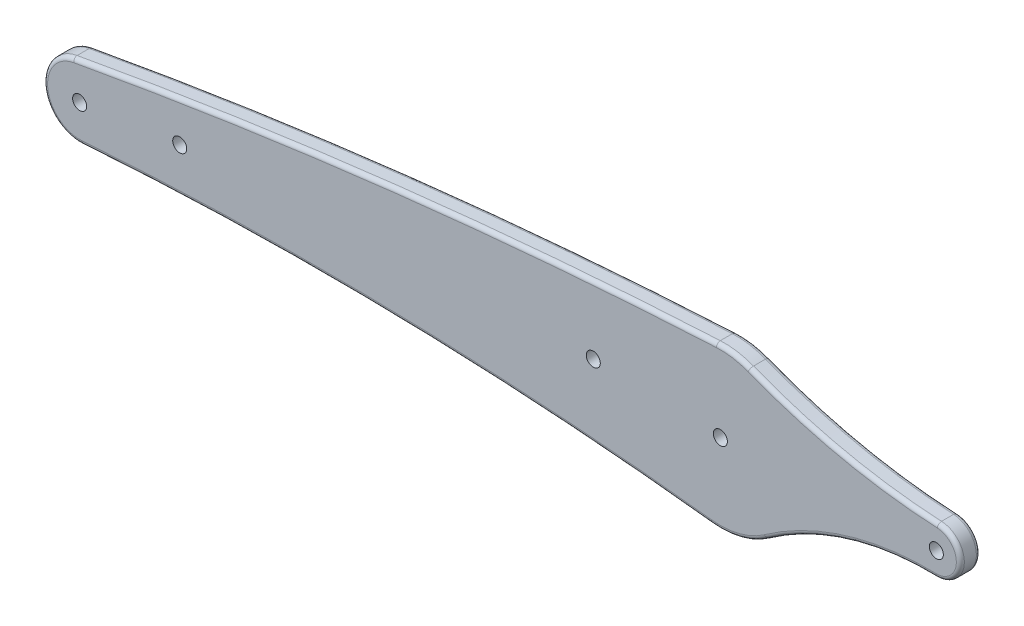
ISO-10303-21;
HEADER;
FILE_DESCRIPTION(('STEP AP214'),'2;1');
FILE_NAME('part.step','',(''),(''),'','','');
FILE_SCHEMA(('AUTOMOTIVE_DESIGN { 1 0 10303 214 1 1 1 1 }'));
ENDSEC;
DATA;
#1=APPLICATION_CONTEXT('core data for automotive mechanical design processes');
#2=APPLICATION_PROTOCOL_DEFINITION('international standard','automotive_design',2000,#1);
#3=PRODUCT_CONTEXT('',#1,'mechanical');
#4=PRODUCT('Part','Part','',(#3));
#5=PRODUCT_RELATED_PRODUCT_CATEGORY('part','',(#4));
#6=PRODUCT_DEFINITION_FORMATION('','',#4);
#7=PRODUCT_DEFINITION_CONTEXT('part definition',#1,'design');
#8=PRODUCT_DEFINITION('design','',#6,#7);
#9=PRODUCT_DEFINITION_SHAPE('','',#8);
#10=(LENGTH_UNIT() NAMED_UNIT(*) SI_UNIT(.MILLI.,.METRE.));
#11=(NAMED_UNIT(*) PLANE_ANGLE_UNIT() SI_UNIT($,.RADIAN.));
#12=(NAMED_UNIT(*) SI_UNIT($,.STERADIAN.) SOLID_ANGLE_UNIT());
#13=UNCERTAINTY_MEASURE_WITH_UNIT(LENGTH_MEASURE(1.E-05),#10,'distance_accuracy_value','');
#14=(GEOMETRIC_REPRESENTATION_CONTEXT(3) GLOBAL_UNCERTAINTY_ASSIGNED_CONTEXT((#13)) GLOBAL_UNIT_ASSIGNED_CONTEXT((#10,
#11,#12)) REPRESENTATION_CONTEXT('',''));
#15=CARTESIAN_POINT('',(0.,0.,0.));
#16=DIRECTION('',(0.,0.,1.));
#17=DIRECTION('',(1.,0.,0.));
#18=AXIS2_PLACEMENT_3D('',#15,#16,#17);
#19=CARTESIAN_POINT('',(69.6215603537575,-1025.09903526355,2.5));
#20=DIRECTION('',(0.,0.,-1.));
#21=DIRECTION('',(-1.,0.,0.));
#22=AXIS2_PLACEMENT_3D('',#19,#20,#21);
#23=CYLINDRICAL_SURFACE('',#22,1250.);
#24=DIRECTION('',(0.,0.,-1.));
#25=VECTOR('',#24,1.);
#26=CARTESIAN_POINT('',(6.19242396528043,223.290625322045,2.5));
#27=LINE('',#26,#25);
#28=CARTESIAN_POINT('',(6.19242396528043,223.290625322045,1.5));
#29=VERTEX_POINT('',#28);
#30=CARTESIAN_POINT('',(6.19242396528043,223.290625322045,-1.5));
#31=VERTEX_POINT('',#30);
#32=EDGE_CURVE('E262',#29,#31,#27,.T.);
#33=ORIENTED_EDGE('',*,*,#32,.T.);
#34=CARTESIAN_POINT('',(69.6215603537575,-1025.09903526355,-1.5));
#35=DIRECTION('',(0.,0.,1.));
#36=DIRECTION('',(1.,0.,0.));
#37=AXIS2_PLACEMENT_3D('',#34,#35,#36);
#38=CIRCLE('',#37,1250.);
#39=CARTESIAN_POINT('',(-154.465632763782,204.650910815208,-1.5));
#40=VERTEX_POINT('',#39);
#41=EDGE_CURVE('E11',#31,#40,#38,.T.);
#42=ORIENTED_EDGE('',*,*,#41,.T.);
#43=DIRECTION('',(0.,0.,-1.));
#44=VECTOR('',#43,1.);
#45=CARTESIAN_POINT('',(-154.465632763782,204.650910815208,2.5));
#46=LINE('',#45,#44);
#47=CARTESIAN_POINT('',(-154.465632763782,204.650910815208,1.5));
#48=VERTEX_POINT('',#47);
#49=EDGE_CURVE('E173',#48,#40,#46,.T.);
#50=ORIENTED_EDGE('',*,*,#49,.F.);
#51=CARTESIAN_POINT('',(69.6215603537575,-1025.09903526355,1.5));
#52=DIRECTION('',(0.,0.,1.));
#53=DIRECTION('',(1.,0.,0.));
#54=AXIS2_PLACEMENT_3D('',#51,#52,#53);
#55=CIRCLE('',#54,1250.);
#56=EDGE_CURVE('E44',#48,#29,#55,.F.);
#57=ORIENTED_EDGE('',*,*,#56,.T.);
#58=EDGE_LOOP('',(#33,#42,#50,#57));
#59=FACE_BOUND('',#58,.T.);
#60=ADVANCED_FACE('F35',(#59),#23,.T.);
#61=CARTESIAN_POINT('',(-152.852204973335,195.796711203441,2.5));
#62=DIRECTION('',(0.,0.,-1.));
#63=DIRECTION('',(-1.,0.,0.));
#64=AXIS2_PLACEMENT_3D('',#61,#62,#63);
#65=CYLINDRICAL_SURFACE('',#64,9.00000000000001);
#66=ORIENTED_EDGE('',*,*,#49,.T.);
#67=CARTESIAN_POINT('',(-152.852204973335,195.796711203441,-1.5));
#68=DIRECTION('',(0.,0.,1.));
#69=DIRECTION('',(1.,0.,0.));
#70=AXIS2_PLACEMENT_3D('',#67,#68,#69);
#71=CIRCLE('',#70,9.00000000000001);
#72=CARTESIAN_POINT('',(-152.212583331485,186.819468633739,-1.5));
#73=VERTEX_POINT('',#72);
#74=EDGE_CURVE('E172',#40,#73,#71,.T.);
#75=ORIENTED_EDGE('',*,*,#74,.T.);
#76=DIRECTION('',(0.,0.,-1.));
#77=VECTOR('',#76,1.);
#78=CARTESIAN_POINT('',(-152.212583331485,186.819468633739,2.5));
#79=LINE('',#78,#77);
#80=CARTESIAN_POINT('',(-152.212583331485,186.819468633739,1.5));
#81=VERTEX_POINT('',#80);
#82=EDGE_CURVE('E155',#81,#73,#79,.T.);
#83=ORIENTED_EDGE('',*,*,#82,.F.);
#84=CARTESIAN_POINT('',(-152.852204973335,195.796711203441,1.5));
#85=DIRECTION('',(0.,0.,1.));
#86=DIRECTION('',(1.,0.,0.));
#87=AXIS2_PLACEMENT_3D('',#84,#85,#86);
#88=CIRCLE('',#87,9.00000000000001);
#89=EDGE_CURVE('E169',#81,#48,#88,.F.);
#90=ORIENTED_EDGE('',*,*,#89,.T.);
#91=EDGE_LOOP('',(#66,#75,#83,#90));
#92=FACE_BOUND('',#91,.T.);
#93=ADVANCED_FACE('F168',(#92),#65,.T.);
#94=CARTESIAN_POINT('',(-91.8038727123033,-661.031218504821,2.5));
#95=DIRECTION('',(0.,0.,-1.));
#96=DIRECTION('',(-1.,0.,0.));
#97=AXIS2_PLACEMENT_3D('',#94,#95,#96);
#98=CYLINDRICAL_SURFACE('',#97,850.);
#99=ORIENTED_EDGE('',*,*,#82,.T.);
#100=CARTESIAN_POINT('',(-91.8038727123033,-661.031218504821,-1.5));
#101=DIRECTION('',(0.,0.,1.));
#102=DIRECTION('',(1.,0.,0.));
#103=AXIS2_PLACEMENT_3D('',#100,#101,#102);
#104=CIRCLE('',#103,850.);
#105=CARTESIAN_POINT('',(4.93117146106389,183.446330769745,-1.5));
#106=VERTEX_POINT('',#105);
#107=EDGE_CURVE('E161',#73,#106,#104,.F.);
#108=ORIENTED_EDGE('',*,*,#107,.T.);
#109=DIRECTION('',(0.,0.,-1.));
#110=VECTOR('',#109,1.);
#111=CARTESIAN_POINT('',(4.93117146106389,183.446330769745,2.5));
#112=LINE('',#111,#110);
#113=CARTESIAN_POINT('',(4.93117146106389,183.446330769745,1.5));
#114=VERTEX_POINT('',#113);
#115=EDGE_CURVE('E157',#114,#106,#112,.T.);
#116=ORIENTED_EDGE('',*,*,#115,.F.);
#117=CARTESIAN_POINT('',(-91.8038727123033,-661.031218504821,1.5));
#118=DIRECTION('',(0.,0.,1.));
#119=DIRECTION('',(1.,0.,0.));
#120=AXIS2_PLACEMENT_3D('',#117,#118,#119);
#121=CIRCLE('',#120,850.);
#122=EDGE_CURVE('E152',#114,#81,#121,.T.);
#123=ORIENTED_EDGE('',*,*,#122,.T.);
#124=EDGE_LOOP('',(#99,#108,#116,#123));
#125=FACE_BOUND('',#124,.T.);
#126=ADVANCED_FACE('F154',(#125),#98,.F.);
#127=CARTESIAN_POINT('',(7.20729014749606,203.316390752676,2.5));
#128=DIRECTION('',(0.,0.,-1.));
#129=DIRECTION('',(-1.,0.,0.));
#130=AXIS2_PLACEMENT_3D('',#127,#128,#129);
#131=CYLINDRICAL_SURFACE('',#130,20.);
#132=ORIENTED_EDGE('',*,*,#115,.T.);
#133=CARTESIAN_POINT('',(7.20729014749606,203.316390752676,-1.5));
#134=DIRECTION('',(0.,0.,1.));
#135=DIRECTION('',(1.,0.,0.));
#136=AXIS2_PLACEMENT_3D('',#133,#134,#135);
#137=CIRCLE('',#136,20.);
#138=CARTESIAN_POINT('',(18.7678146313222,186.996026980417,-1.5));
#139=VERTEX_POINT('',#138);
#140=EDGE_CURVE('E299',#106,#139,#137,.T.);
#141=ORIENTED_EDGE('',*,*,#140,.T.);
#142=DIRECTION('',(0.,0.,-1.));
#143=VECTOR('',#142,1.);
#144=CARTESIAN_POINT('',(18.7678146313222,186.996026980417,2.5));
#145=LINE('',#144,#143);
#146=CARTESIAN_POINT('',(18.7678146313222,186.996026980417,1.5));
#147=VERTEX_POINT('',#146);
#148=EDGE_CURVE('E274',#147,#139,#145,.T.);
#149=ORIENTED_EDGE('',*,*,#148,.F.);
#150=CARTESIAN_POINT('',(7.20729014749606,203.316390752676,1.5));
#151=DIRECTION('',(0.,0.,1.));
#152=DIRECTION('',(1.,0.,0.));
#153=AXIS2_PLACEMENT_3D('',#150,#151,#152);
#154=CIRCLE('',#153,20.);
#155=EDGE_CURVE('E297',#147,#114,#154,.F.);
#156=ORIENTED_EDGE('',*,*,#155,.T.);
#157=EDGE_LOOP('',(#132,#141,#149,#156));
#158=FACE_BOUND('',#157,.T.);
#159=ADVANCED_FACE('F367',(#158),#131,.T.);
#160=CARTESIAN_POINT('',(59.2296503247137,129.874753777512,2.5));
#161=DIRECTION('',(0.,0.,-1.));
#162=DIRECTION('',(-1.,0.,0.));
#163=AXIS2_PLACEMENT_3D('',#160,#161,#162);
#164=CYLINDRICAL_SURFACE('',#163,70.);
#165=ORIENTED_EDGE('',*,*,#148,.T.);
#166=CARTESIAN_POINT('',(59.2296503247137,129.874753777512,-1.5));
#167=DIRECTION('',(0.,0.,1.));
#168=DIRECTION('',(1.,0.,0.));
#169=AXIS2_PLACEMENT_3D('',#166,#167,#168);
#170=CIRCLE('',#169,70.);
#171=CARTESIAN_POINT('',(60.9963625501948,199.852455425339,-1.5));
#172=VERTEX_POINT('',#171);
#173=EDGE_CURVE('E303',#139,#172,#170,.F.);
#174=ORIENTED_EDGE('',*,*,#173,.T.);
#175=DIRECTION('',(0.,0.,-1.));
#176=VECTOR('',#175,1.);
#177=CARTESIAN_POINT('',(60.9963625501948,199.852455425339,2.5));
#178=LINE('',#177,#176);
#179=CARTESIAN_POINT('',(60.9963625501948,199.852455425339,1.5));
#180=VERTEX_POINT('',#179);
#181=EDGE_CURVE('E271',#180,#172,#178,.T.);
#182=ORIENTED_EDGE('',*,*,#181,.F.);
#183=CARTESIAN_POINT('',(59.2296503247137,129.874753777512,1.5));
#184=DIRECTION('',(0.,0.,1.));
#185=DIRECTION('',(1.,0.,0.));
#186=AXIS2_PLACEMENT_3D('',#183,#184,#185);
#187=CIRCLE('',#186,70.);
#188=EDGE_CURVE('E301',#180,#147,#187,.T.);
#189=ORIENTED_EDGE('',*,*,#188,.T.);
#190=EDGE_LOOP('',(#165,#174,#182,#189));
#191=FACE_BOUND('',#190,.T.);
#192=ADVANCED_FACE('F365',(#191),#164,.F.);
#193=CARTESIAN_POINT('',(61.1477950266646,205.85054413801,2.5));
#194=DIRECTION('',(0.,0.,-1.));
#195=DIRECTION('',(-1.,0.,0.));
#196=AXIS2_PLACEMENT_3D('',#193,#194,#195);
#197=CYLINDRICAL_SURFACE('',#196,6.);
#198=ORIENTED_EDGE('',*,*,#181,.T.);
#199=CARTESIAN_POINT('',(61.1477950266646,205.85054413801,-1.5));
#200=DIRECTION('',(0.,0.,1.));
#201=DIRECTION('',(1.,0.,0.));
#202=AXIS2_PLACEMENT_3D('',#199,#200,#201);
#203=CIRCLE('',#202,6.);
#204=CARTESIAN_POINT('',(61.4538206674936,211.842734748058,-1.5));
#205=VERTEX_POINT('',#204);
#206=EDGE_CURVE('E307',#172,#205,#203,.T.);
#207=ORIENTED_EDGE('',*,*,#206,.T.);
#208=DIRECTION('',(0.,0.,-1.));
#209=VECTOR('',#208,1.);
#210=CARTESIAN_POINT('',(61.4538206674936,211.842734748058,2.5));
#211=LINE('',#210,#209);
#212=CARTESIAN_POINT('',(61.4538206674936,211.842734748058,1.5));
#213=VERTEX_POINT('',#212);
#214=EDGE_CURVE('E268',#213,#205,#211,.T.);
#215=ORIENTED_EDGE('',*,*,#214,.F.);
#216=CARTESIAN_POINT('',(61.1477950266646,205.85054413801,1.5));
#217=DIRECTION('',(0.,0.,1.));
#218=DIRECTION('',(1.,0.,0.));
#219=AXIS2_PLACEMENT_3D('',#216,#217,#218);
#220=CIRCLE('',#219,6.);
#221=EDGE_CURVE('E305',#213,#180,#220,.F.);
#222=ORIENTED_EDGE('',*,*,#221,.T.);
#223=EDGE_LOOP('',(#198,#207,#215,#222));
#224=FACE_BOUND('',#223,.T.);
#225=ADVANCED_FACE('F356',(#224),#197,.T.);
#226=CARTESIAN_POINT('',(69.1044616882186,361.647499999275,2.5));
#227=DIRECTION('',(0.,0.,-1.));
#228=DIRECTION('',(-1.,0.,0.));
#229=AXIS2_PLACEMENT_3D('',#226,#227,#228);
#230=CYLINDRICAL_SURFACE('',#229,150.);
#231=ORIENTED_EDGE('',*,*,#214,.T.);
#232=CARTESIAN_POINT('',(69.1044616882186,361.647499999275,-1.5));
#233=DIRECTION('',(0.,0.,1.));
#234=DIRECTION('',(1.,0.,0.));
#235=AXIS2_PLACEMENT_3D('',#232,#233,#234);
#236=CIRCLE('',#235,150.);
#237=CARTESIAN_POINT('',(14.4893103287575,221.943580075805,-1.5));
#238=VERTEX_POINT('',#237);
#239=EDGE_CURVE('E311',#205,#238,#236,.F.);
#240=ORIENTED_EDGE('',*,*,#239,.T.);
#241=DIRECTION('',(0.,0.,-1.));
#242=VECTOR('',#241,1.);
#243=CARTESIAN_POINT('',(14.4893103287575,221.943580075805,2.5));
#244=LINE('',#243,#242);
#245=CARTESIAN_POINT('',(14.4893103287575,221.943580075805,1.5));
#246=VERTEX_POINT('',#245);
#247=EDGE_CURVE('E265',#246,#238,#244,.T.);
#248=ORIENTED_EDGE('',*,*,#247,.F.);
#249=CARTESIAN_POINT('',(69.1044616882186,361.647499999275,1.5));
#250=DIRECTION('',(0.,0.,1.));
#251=DIRECTION('',(1.,0.,0.));
#252=AXIS2_PLACEMENT_3D('',#249,#250,#251);
#253=CIRCLE('',#252,150.);
#254=EDGE_CURVE('E309',#246,#213,#253,.T.);
#255=ORIENTED_EDGE('',*,*,#254,.T.);
#256=EDGE_LOOP('',(#231,#240,#248,#255));
#257=FACE_BOUND('',#256,.T.);
#258=ADVANCED_FACE('F353',(#257),#230,.F.);
#259=CARTESIAN_POINT('',(7.20729014749606,203.316390752676,2.5));
#260=DIRECTION('',(0.,0.,-1.));
#261=DIRECTION('',(-1.,0.,0.));
#262=AXIS2_PLACEMENT_3D('',#259,#260,#261);
#263=CYLINDRICAL_SURFACE('',#262,1.75);
#264=CARTESIAN_POINT('',(7.20729014749606,203.316390752676,2.5));
#265=DIRECTION('',(0.,0.,1.));
#266=DIRECTION('',(1.,0.,0.));
#267=AXIS2_PLACEMENT_3D('',#264,#265,#266);
#268=CIRCLE('',#267,1.75);
#269=CARTESIAN_POINT('',(8.95729014749606,203.316390752676,2.5));
#270=VERTEX_POINT('',#269);
#271=EDGE_CURVE('E659',#270,#270,#268,.T.);
#272=ORIENTED_EDGE('',*,*,#271,.T.);
#273=EDGE_LOOP('',(#272));
#274=FACE_BOUND('',#273,.T.);
#275=CARTESIAN_POINT('',(7.20729014749606,203.316390752676,-2.5));
#276=DIRECTION('',(0.,0.,1.));
#277=DIRECTION('',(1.,0.,0.));
#278=AXIS2_PLACEMENT_3D('',#275,#276,#277);
#279=CIRCLE('',#278,1.75);
#280=CARTESIAN_POINT('',(8.95729014749606,203.316390752676,-2.5));
#281=VERTEX_POINT('',#280);
#282=EDGE_CURVE('E255',#281,#281,#279,.T.);
#283=ORIENTED_EDGE('',*,*,#282,.F.);
#284=EDGE_LOOP('',(#283));
#285=FACE_BOUND('',#284,.T.);
#286=ADVANCED_FACE('F576',(#274,#285),#263,.F.);
#287=CARTESIAN_POINT('',(-152.852204973335,195.796711203441,2.5));
#288=DIRECTION('',(0.,0.,-1.));
#289=DIRECTION('',(-1.,0.,0.));
#290=AXIS2_PLACEMENT_3D('',#287,#288,#289);
#291=CYLINDRICAL_SURFACE('',#290,1.75000000000001);
#292=CARTESIAN_POINT('',(-152.852204973335,195.796711203441,2.5));
#293=DIRECTION('',(0.,0.,1.));
#294=DIRECTION('',(1.,0.,0.));
#295=AXIS2_PLACEMENT_3D('',#292,#293,#294);
#296=CIRCLE('',#295,1.75000000000001);
#297=CARTESIAN_POINT('',(-151.102204973335,195.796711203441,2.5));
#298=VERTEX_POINT('',#297);
#299=EDGE_CURVE('E666',#298,#298,#296,.T.);
#300=ORIENTED_EDGE('',*,*,#299,.T.);
#301=EDGE_LOOP('',(#300));
#302=FACE_BOUND('',#301,.T.);
#303=CARTESIAN_POINT('',(-152.852204973335,195.796711203441,-2.5));
#304=DIRECTION('',(0.,0.,1.));
#305=DIRECTION('',(1.,0.,0.));
#306=AXIS2_PLACEMENT_3D('',#303,#304,#305);
#307=CIRCLE('',#306,1.75000000000001);
#308=CARTESIAN_POINT('',(-151.102204973335,195.796711203441,-2.5));
#309=VERTEX_POINT('',#308);
#310=EDGE_CURVE('E247',#309,#309,#307,.T.);
#311=ORIENTED_EDGE('',*,*,#310,.F.);
#312=EDGE_LOOP('',(#311));
#313=FACE_BOUND('',#312,.T.);
#314=ADVANCED_FACE('F564',(#302,#313),#291,.F.);
#315=ORIENTED_EDGE('',*,*,#247,.T.);
#316=CARTESIAN_POINT('',(7.20729014749606,203.316390752676,-1.5));
#317=DIRECTION('',(0.,0.,1.));
#318=DIRECTION('',(1.,0.,0.));
#319=AXIS2_PLACEMENT_3D('',#316,#317,#318);
#320=CIRCLE('',#319,20.);
#321=EDGE_CURVE('E315',#238,#31,#320,.T.);
#322=ORIENTED_EDGE('',*,*,#321,.T.);
#323=ORIENTED_EDGE('',*,*,#32,.F.);
#324=CARTESIAN_POINT('',(7.20729014749606,203.316390752676,1.5));
#325=DIRECTION('',(0.,0.,1.));
#326=DIRECTION('',(1.,0.,0.));
#327=AXIS2_PLACEMENT_3D('',#324,#325,#326);
#328=CIRCLE('',#327,20.);
#329=EDGE_CURVE('E313',#29,#246,#328,.F.);
#330=ORIENTED_EDGE('',*,*,#329,.T.);
#331=EDGE_LOOP('',(#315,#322,#323,#330));
#332=FACE_BOUND('',#331,.T.);
#333=ADVANCED_FACE('F337',(#332),#131,.T.);
#334=CARTESIAN_POINT('',(-24.5427098525039,204.413331435151,2.5));
#335=DIRECTION('',(0.,0.,-1.));
#336=DIRECTION('',(-1.,0.,0.));
#337=AXIS2_PLACEMENT_3D('',#334,#335,#336);
#338=CYLINDRICAL_SURFACE('',#337,1.75);
#339=CARTESIAN_POINT('',(-24.5427098525039,204.413331435151,2.5));
#340=DIRECTION('',(0.,0.,1.));
#341=DIRECTION('',(1.,0.,0.));
#342=AXIS2_PLACEMENT_3D('',#339,#340,#341);
#343=CIRCLE('',#342,1.75);
#344=CARTESIAN_POINT('',(-22.7927098525039,204.413331435151,2.5));
#345=VERTEX_POINT('',#344);
#346=EDGE_CURVE('E669',#345,#345,#343,.T.);
#347=ORIENTED_EDGE('',*,*,#346,.T.);
#348=EDGE_LOOP('',(#347));
#349=FACE_BOUND('',#348,.T.);
#350=CARTESIAN_POINT('',(-24.5427098525039,204.413331435151,-2.5));
#351=DIRECTION('',(0.,0.,1.));
#352=DIRECTION('',(1.,0.,0.));
#353=AXIS2_PLACEMENT_3D('',#350,#351,#352);
#354=CIRCLE('',#353,1.75);
#355=CARTESIAN_POINT('',(-22.7927098525039,204.413331435151,-2.5));
#356=VERTEX_POINT('',#355);
#357=EDGE_CURVE('E242',#356,#356,#354,.T.);
#358=ORIENTED_EDGE('',*,*,#357,.F.);
#359=EDGE_LOOP('',(#358));
#360=FACE_BOUND('',#359,.T.);
#361=ADVANCED_FACE('F410',(#349,#360),#338,.F.);
#362=CARTESIAN_POINT('',(-127.852204973335,199.130573991175,2.5));
#363=DIRECTION('',(0.,0.,-1.));
#364=DIRECTION('',(-1.,0.,0.));
#365=AXIS2_PLACEMENT_3D('',#362,#363,#364);
#366=CYLINDRICAL_SURFACE('',#365,1.75000000000001);
#367=CARTESIAN_POINT('',(-127.852204973335,199.130573991175,2.5));
#368=DIRECTION('',(0.,0.,1.));
#369=DIRECTION('',(1.,0.,0.));
#370=AXIS2_PLACEMENT_3D('',#367,#368,#369);
#371=CIRCLE('',#370,1.75000000000001);
#372=CARTESIAN_POINT('',(-126.102204973335,199.130573991175,2.5));
#373=VERTEX_POINT('',#372);
#374=EDGE_CURVE('E261',#373,#373,#371,.T.);
#375=ORIENTED_EDGE('',*,*,#374,.T.);
#376=EDGE_LOOP('',(#375));
#377=FACE_BOUND('',#376,.T.);
#378=CARTESIAN_POINT('',(-127.852204973335,199.130573991175,-2.5));
#379=DIRECTION('',(0.,0.,1.));
#380=DIRECTION('',(1.,0.,0.));
#381=AXIS2_PLACEMENT_3D('',#378,#379,#380);
#382=CIRCLE('',#381,1.75000000000001);
#383=CARTESIAN_POINT('',(-126.102204973335,199.130573991175,-2.5));
#384=VERTEX_POINT('',#383);
#385=EDGE_CURVE('E236',#384,#384,#382,.T.);
#386=ORIENTED_EDGE('',*,*,#385,.F.);
#387=EDGE_LOOP('',(#386));
#388=FACE_BOUND('',#387,.T.);
#389=ADVANCED_FACE('F413',(#377,#388),#366,.F.);
#390=CARTESIAN_POINT('',(61.1477950266646,205.85054413801,2.5));
#391=DIRECTION('',(0.,0.,-1.));
#392=DIRECTION('',(-1.,0.,0.));
#393=AXIS2_PLACEMENT_3D('',#390,#391,#392);
#394=CYLINDRICAL_SURFACE('',#393,1.75);
#395=CARTESIAN_POINT('',(61.1477950266646,205.85054413801,2.5));
#396=DIRECTION('',(0.,0.,1.));
#397=DIRECTION('',(1.,0.,0.));
#398=AXIS2_PLACEMENT_3D('',#395,#396,#397);
#399=CIRCLE('',#398,1.75);
#400=CARTESIAN_POINT('',(62.8977950266646,205.85054413801,2.5));
#401=VERTEX_POINT('',#400);
#402=EDGE_CURVE('E250',#401,#401,#399,.T.);
#403=ORIENTED_EDGE('',*,*,#402,.T.);
#404=EDGE_LOOP('',(#403));
#405=FACE_BOUND('',#404,.T.);
#406=CARTESIAN_POINT('',(61.1477950266646,205.85054413801,-2.5));
#407=DIRECTION('',(0.,0.,1.));
#408=DIRECTION('',(1.,0.,0.));
#409=AXIS2_PLACEMENT_3D('',#406,#407,#408);
#410=CIRCLE('',#409,1.75);
#411=CARTESIAN_POINT('',(62.8977950266646,205.85054413801,-2.5));
#412=VERTEX_POINT('',#411);
#413=EDGE_CURVE('E258',#412,#412,#410,.T.);
#414=ORIENTED_EDGE('',*,*,#413,.F.);
#415=EDGE_LOOP('',(#414));
#416=FACE_BOUND('',#415,.T.);
#417=ADVANCED_FACE('F417',(#405,#416),#394,.F.);
#418=CARTESIAN_POINT('',(0.,0.,2.5));
#419=DIRECTION('',(0.,0.,1.));
#420=DIRECTION('',(1.,0.,0.));
#421=AXIS2_PLACEMENT_3D('',#418,#419,#420);
#422=PLANE('',#421);
#423=CARTESIAN_POINT('',(69.6215603537575,-1025.09903526355,2.5));
#424=DIRECTION('',(0.,0.,1.));
#425=DIRECTION('',(1.,0.,0.));
#426=AXIS2_PLACEMENT_3D('',#423,#424,#425);
#427=CIRCLE('',#426,1249.);
#428=CARTESIAN_POINT('',(6.24316727439121,222.291913593577,2.5));
#429=VERTEX_POINT('',#428);
#430=CARTESIAN_POINT('',(-154.286363009288,203.667110858345,2.5));
#431=VERTEX_POINT('',#430);
#432=EDGE_CURVE('E317',#429,#431,#427,.T.);
#433=ORIENTED_EDGE('',*,*,#432,.T.);
#434=CARTESIAN_POINT('',(-152.852204973335,195.796711203441,2.5));
#435=DIRECTION('',(0.,0.,1.));
#436=DIRECTION('',(1.,0.,0.));
#437=AXIS2_PLACEMENT_3D('',#434,#435,#436);
#438=CIRCLE('',#437,8.00000000000001);
#439=CARTESIAN_POINT('',(-152.283652402802,187.816940030372,2.5));
#440=VERTEX_POINT('',#439);
#441=EDGE_CURVE('E330',#431,#440,#438,.T.);
#442=ORIENTED_EDGE('',*,*,#441,.T.);
#443=CARTESIAN_POINT('',(-91.8038727123033,-661.031218504821,2.5));
#444=DIRECTION('',(0.,0.,1.));
#445=DIRECTION('',(1.,0.,0.));
#446=AXIS2_PLACEMENT_3D('',#443,#444,#445);
#447=CIRCLE('',#446,851.);
#448=CARTESIAN_POINT('',(5.0449773953855,184.439833768892,2.5));
#449=VERTEX_POINT('',#448);
#450=EDGE_CURVE('E59',#440,#449,#447,.F.);
#451=ORIENTED_EDGE('',*,*,#450,.T.);
#452=CARTESIAN_POINT('',(7.20729014749606,203.316390752676,2.5));
#453=DIRECTION('',(0.,0.,1.));
#454=DIRECTION('',(1.,0.,0.));
#455=AXIS2_PLACEMENT_3D('',#452,#453,#454);
#456=CIRCLE('',#455,19.);
#457=CARTESIAN_POINT('',(18.1897884071309,187.81204516903,2.5));
#458=VERTEX_POINT('',#457);
#459=EDGE_CURVE('E327',#449,#458,#456,.T.);
#460=ORIENTED_EDGE('',*,*,#459,.T.);
#461=CARTESIAN_POINT('',(59.2296503247137,129.874753777512,2.5));
#462=DIRECTION('',(0.,0.,1.));
#463=DIRECTION('',(1.,0.,0.));
#464=AXIS2_PLACEMENT_3D('',#461,#462,#463);
#465=CIRCLE('',#464,71.);
#466=CARTESIAN_POINT('',(61.0216012962731,200.852136877451,2.5));
#467=VERTEX_POINT('',#466);
#468=EDGE_CURVE('E325',#458,#467,#465,.F.);
#469=ORIENTED_EDGE('',*,*,#468,.T.);
#470=CARTESIAN_POINT('',(61.1477950266646,205.85054413801,2.5));
#471=DIRECTION('',(0.,0.,1.));
#472=DIRECTION('',(1.,0.,0.));
#473=AXIS2_PLACEMENT_3D('',#470,#471,#472);
#474=CIRCLE('',#473,5.);
#475=CARTESIAN_POINT('',(61.4028163940221,210.84403631305,2.5));
#476=VERTEX_POINT('',#475);
#477=EDGE_CURVE('E323',#467,#476,#474,.T.);
#478=ORIENTED_EDGE('',*,*,#477,.T.);
#479=CARTESIAN_POINT('',(69.1044616882186,361.647499999275,2.5));
#480=DIRECTION('',(0.,0.,1.));
#481=DIRECTION('',(1.,0.,0.));
#482=AXIS2_PLACEMENT_3D('',#479,#480,#481);
#483=CIRCLE('',#482,151.);
#484=CARTESIAN_POINT('',(14.1252093196945,221.012220609649,2.5));
#485=VERTEX_POINT('',#484);
#486=EDGE_CURVE('E321',#476,#485,#483,.F.);
#487=ORIENTED_EDGE('',*,*,#486,.T.);
#488=CARTESIAN_POINT('',(7.20729014749606,203.316390752676,2.5));
#489=DIRECTION('',(0.,0.,1.));
#490=DIRECTION('',(1.,0.,0.));
#491=AXIS2_PLACEMENT_3D('',#488,#489,#490);
#492=CIRCLE('',#491,19.);
#493=EDGE_CURVE('E319',#485,#429,#492,.T.);
#494=ORIENTED_EDGE('',*,*,#493,.T.);
#495=EDGE_LOOP('',(#433,#442,#451,#460,#469,#478,#487,#494));
#496=FACE_BOUND('',#495,.T.);
#497=ORIENTED_EDGE('',*,*,#374,.F.);
#498=EDGE_LOOP('',(#497));
#499=FACE_BOUND('',#498,.T.);
#500=ORIENTED_EDGE('',*,*,#346,.F.);
#501=EDGE_LOOP('',(#500));
#502=FACE_BOUND('',#501,.T.);
#503=ORIENTED_EDGE('',*,*,#299,.F.);
#504=EDGE_LOOP('',(#503));
#505=FACE_BOUND('',#504,.T.);
#506=ORIENTED_EDGE('',*,*,#271,.F.);
#507=EDGE_LOOP('',(#506));
#508=FACE_BOUND('',#507,.T.);
#509=ORIENTED_EDGE('',*,*,#402,.F.);
#510=EDGE_LOOP('',(#509));
#511=FACE_BOUND('',#510,.T.);
#512=ADVANCED_FACE('F347',(#496,#499,#502,#505,#508,#511),#422,.T.);
#513=CARTESIAN_POINT('',(0.,0.,-2.5));
#514=DIRECTION('',(0.,0.,1.));
#515=DIRECTION('',(1.,0.,0.));
#516=AXIS2_PLACEMENT_3D('',#513,#514,#515);
#517=PLANE('',#516);
#518=CARTESIAN_POINT('',(-91.8038727123033,-661.031218504821,-2.5));
#519=DIRECTION('',(0.,0.,1.));
#520=DIRECTION('',(1.,0.,0.));
#521=AXIS2_PLACEMENT_3D('',#518,#519,#520);
#522=CIRCLE('',#521,851.);
#523=CARTESIAN_POINT('',(5.0449773953855,184.439833768892,-2.5));
#524=VERTEX_POINT('',#523);
#525=CARTESIAN_POINT('',(-152.283652402802,187.816940030372,-2.5));
#526=VERTEX_POINT('',#525);
#527=EDGE_CURVE('E292',#524,#526,#522,.T.);
#528=ORIENTED_EDGE('',*,*,#527,.T.);
#529=CARTESIAN_POINT('',(-152.852204973335,195.796711203441,-2.5));
#530=DIRECTION('',(0.,0.,1.));
#531=DIRECTION('',(1.,0.,0.));
#532=AXIS2_PLACEMENT_3D('',#529,#530,#531);
#533=CIRCLE('',#532,8.00000000000001);
#534=CARTESIAN_POINT('',(-154.286363009288,203.667110858345,-2.5));
#535=VERTEX_POINT('',#534);
#536=EDGE_CURVE('E162',#526,#535,#533,.F.);
#537=ORIENTED_EDGE('',*,*,#536,.T.);
#538=CARTESIAN_POINT('',(69.6215603537575,-1025.09903526355,-2.5));
#539=DIRECTION('',(0.,0.,1.));
#540=DIRECTION('',(1.,0.,0.));
#541=AXIS2_PLACEMENT_3D('',#538,#539,#540);
#542=CIRCLE('',#541,1249.);
#543=CARTESIAN_POINT('',(6.24316727439121,222.291913593577,-2.5));
#544=VERTEX_POINT('',#543);
#545=EDGE_CURVE('E280',#535,#544,#542,.F.);
#546=ORIENTED_EDGE('',*,*,#545,.T.);
#547=CARTESIAN_POINT('',(7.20729014749606,203.316390752676,-2.5));
#548=DIRECTION('',(0.,0.,1.));
#549=DIRECTION('',(1.,0.,0.));
#550=AXIS2_PLACEMENT_3D('',#547,#548,#549);
#551=CIRCLE('',#550,19.);
#552=CARTESIAN_POINT('',(14.1252093196945,221.012220609649,-2.5));
#553=VERTEX_POINT('',#552);
#554=EDGE_CURVE('E282',#544,#553,#551,.F.);
#555=ORIENTED_EDGE('',*,*,#554,.T.);
#556=CARTESIAN_POINT('',(69.1044616882186,361.647499999275,-2.5));
#557=DIRECTION('',(0.,0.,1.));
#558=DIRECTION('',(1.,0.,0.));
#559=AXIS2_PLACEMENT_3D('',#556,#557,#558);
#560=CIRCLE('',#559,151.);
#561=CARTESIAN_POINT('',(61.4028163940221,210.84403631305,-2.5));
#562=VERTEX_POINT('',#561);
#563=EDGE_CURVE('E284',#553,#562,#560,.T.);
#564=ORIENTED_EDGE('',*,*,#563,.T.);
#565=CARTESIAN_POINT('',(61.1477950266646,205.85054413801,-2.5));
#566=DIRECTION('',(0.,0.,1.));
#567=DIRECTION('',(1.,0.,0.));
#568=AXIS2_PLACEMENT_3D('',#565,#566,#567);
#569=CIRCLE('',#568,5.);
#570=CARTESIAN_POINT('',(61.0216012962731,200.852136877451,-2.5));
#571=VERTEX_POINT('',#570);
#572=EDGE_CURVE('E286',#562,#571,#569,.F.);
#573=ORIENTED_EDGE('',*,*,#572,.T.);
#574=CARTESIAN_POINT('',(59.2296503247137,129.874753777512,-2.5));
#575=DIRECTION('',(0.,0.,1.));
#576=DIRECTION('',(1.,0.,0.));
#577=AXIS2_PLACEMENT_3D('',#574,#575,#576);
#578=CIRCLE('',#577,71.);
#579=CARTESIAN_POINT('',(18.1897884071309,187.81204516903,-2.5));
#580=VERTEX_POINT('',#579);
#581=EDGE_CURVE('E288',#571,#580,#578,.T.);
#582=ORIENTED_EDGE('',*,*,#581,.T.);
#583=CARTESIAN_POINT('',(7.20729014749606,203.316390752676,-2.5));
#584=DIRECTION('',(0.,0.,1.));
#585=DIRECTION('',(1.,0.,0.));
#586=AXIS2_PLACEMENT_3D('',#583,#584,#585);
#587=CIRCLE('',#586,19.);
#588=EDGE_CURVE('E290',#580,#524,#587,.F.);
#589=ORIENTED_EDGE('',*,*,#588,.T.);
#590=EDGE_LOOP('',(#528,#537,#546,#555,#564,#573,#582,#589));
#591=FACE_BOUND('',#590,.T.);
#592=ORIENTED_EDGE('',*,*,#385,.T.);
#593=EDGE_LOOP('',(#592));
#594=FACE_BOUND('',#593,.T.);
#595=ORIENTED_EDGE('',*,*,#357,.T.);
#596=EDGE_LOOP('',(#595));
#597=FACE_BOUND('',#596,.T.);
#598=ORIENTED_EDGE('',*,*,#310,.T.);
#599=EDGE_LOOP('',(#598));
#600=FACE_BOUND('',#599,.T.);
#601=ORIENTED_EDGE('',*,*,#282,.T.);
#602=EDGE_LOOP('',(#601));
#603=FACE_BOUND('',#602,.T.);
#604=ORIENTED_EDGE('',*,*,#413,.T.);
#605=EDGE_LOOP('',(#604));
#606=FACE_BOUND('',#605,.T.);
#607=ADVANCED_FACE('F378',(#591,#594,#597,#600,#603,#606),#517,.F.);
#608=CARTESIAN_POINT('',(61.1477950266646,205.85054413801,-1.5));
#609=DIRECTION('',(0.,0.,1.));
#610=DIRECTION('',(1.,0.,0.));
#611=AXIS2_PLACEMENT_3D('',#608,#609,#610);
#612=TOROIDAL_SURFACE('',#611,5.,1.);
#613=CARTESIAN_POINT('',(61.0216012962731,200.852136877451,-1.5));
#614=DIRECTION('',(-0.999681452111819,0.0252387460783008,0.));
#615=DIRECTION('',(-0.0252387460783008,-0.999681452111819,0.));
#616=AXIS2_PLACEMENT_3D('',#613,#614,#615);
#617=CIRCLE('',#616,1.);
#618=EDGE_CURVE('E229',#571,#172,#617,.T.);
#619=ORIENTED_EDGE('',*,*,#618,.F.);
#620=ORIENTED_EDGE('',*,*,#572,.F.);
#621=CARTESIAN_POINT('',(61.4028163940221,210.84403631305,-1.5));
#622=DIRECTION('',(-0.998698435008108,0.0510042734715029,0.));
#623=DIRECTION('',(-0.0510042734715029,-0.998698435008108,0.));
#624=AXIS2_PLACEMENT_3D('',#621,#622,#623);
#625=CIRCLE('',#624,1.);
#626=EDGE_CURVE('E185',#205,#562,#625,.T.);
#627=ORIENTED_EDGE('',*,*,#626,.F.);
#628=ORIENTED_EDGE('',*,*,#206,.F.);
#629=EDGE_LOOP('',(#619,#620,#627,#628));
#630=FACE_BOUND('',#629,.T.);
#631=ADVANCED_FACE('F392',(#630),#612,.T.);
#632=CARTESIAN_POINT('',(69.1044616882186,361.647499999275,-1.5));
#633=DIRECTION('',(0.,0.,1.));
#634=DIRECTION('',(1.,0.,0.));
#635=AXIS2_PLACEMENT_3D('',#632,#633,#634);
#636=TOROIDAL_SURFACE('',#635,151.,1.);
#637=ORIENTED_EDGE('',*,*,#626,.T.);
#638=ORIENTED_EDGE('',*,*,#563,.F.);
#639=CARTESIAN_POINT('',(14.1252093196945,221.012220609649,-1.5));
#640=DIRECTION('',(-0.931359466156464,0.364101009063072,0.));
#641=DIRECTION('',(-0.364101009063072,-0.931359466156464,0.));
#642=AXIS2_PLACEMENT_3D('',#639,#640,#641);
#643=CIRCLE('',#642,1.);
#644=EDGE_CURVE('E227',#238,#553,#643,.T.);
#645=ORIENTED_EDGE('',*,*,#644,.F.);
#646=ORIENTED_EDGE('',*,*,#239,.F.);
#647=EDGE_LOOP('',(#637,#638,#645,#646));
#648=FACE_BOUND('',#647,.T.);
#649=ADVANCED_FACE('F389',(#648),#636,.T.);
#650=CARTESIAN_POINT('',(59.2296503247137,129.874753777512,-1.5));
#651=DIRECTION('',(0.,0.,1.));
#652=DIRECTION('',(1.,0.,0.));
#653=AXIS2_PLACEMENT_3D('',#650,#651,#652);
#654=TOROIDAL_SURFACE('',#653,71.,1.);
#655=ORIENTED_EDGE('',*,*,#618,.T.);
#656=ORIENTED_EDGE('',*,*,#173,.F.);
#657=CARTESIAN_POINT('',(18.1897884071309,187.81204516903,-1.5));
#658=DIRECTION('',(-0.816018188612938,-0.578026224191308,0.));
#659=DIRECTION('',(0.578026224191308,-0.816018188612938,0.));
#660=AXIS2_PLACEMENT_3D('',#657,#658,#659);
#661=CIRCLE('',#660,1.);
#662=EDGE_CURVE('E224',#580,#139,#661,.T.);
#663=ORIENTED_EDGE('',*,*,#662,.F.);
#664=ORIENTED_EDGE('',*,*,#581,.F.);
#665=EDGE_LOOP('',(#655,#656,#663,#664));
#666=FACE_BOUND('',#665,.T.);
#667=ADVANCED_FACE('F393',(#666),#654,.T.);
#668=CARTESIAN_POINT('',(7.20729014749606,203.316390752676,-1.5));
#669=DIRECTION('',(0.,0.,1.));
#670=DIRECTION('',(1.,0.,0.));
#671=AXIS2_PLACEMENT_3D('',#668,#669,#670);
#672=TOROIDAL_SURFACE('',#671,19.,1.);
#673=ORIENTED_EDGE('',*,*,#644,.T.);
#674=ORIENTED_EDGE('',*,*,#554,.F.);
#675=CARTESIAN_POINT('',(6.24316727439121,222.291913593577,-1.5));
#676=DIRECTION('',(-0.998711728468474,-0.0507433091107824,0.));
#677=DIRECTION('',(0.0507433091107824,-0.998711728468474,0.));
#678=AXIS2_PLACEMENT_3D('',#675,#676,#677);
#679=CIRCLE('',#678,1.);
#680=EDGE_CURVE('E221',#31,#544,#679,.T.);
#681=ORIENTED_EDGE('',*,*,#680,.F.);
#682=ORIENTED_EDGE('',*,*,#321,.F.);
#683=EDGE_LOOP('',(#673,#674,#681,#682));
#684=FACE_BOUND('',#683,.T.);
#685=ADVANCED_FACE('F387',(#684),#672,.T.);
#686=CARTESIAN_POINT('',(7.20729014749606,203.316390752676,-1.5));
#687=DIRECTION('',(0.,0.,1.));
#688=DIRECTION('',(1.,0.,0.));
#689=AXIS2_PLACEMENT_3D('',#686,#687,#688);
#690=TOROIDAL_SURFACE('',#689,19.,1.);
#691=ORIENTED_EDGE('',*,*,#662,.T.);
#692=ORIENTED_EDGE('',*,*,#140,.F.);
#693=CARTESIAN_POINT('',(5.0449773953855,184.439833768892,-1.5));
#694=DIRECTION('',(-0.993502999146548,0.113805934321607,0.));
#695=DIRECTION('',(-0.113805934321607,-0.993502999146548,0.));
#696=AXIS2_PLACEMENT_3D('',#693,#694,#695);
#697=CIRCLE('',#696,1.);
#698=EDGE_CURVE('E215',#524,#106,#697,.T.);
#699=ORIENTED_EDGE('',*,*,#698,.F.);
#700=ORIENTED_EDGE('',*,*,#588,.F.);
#701=EDGE_LOOP('',(#691,#692,#699,#700));
#702=FACE_BOUND('',#701,.T.);
#703=ADVANCED_FACE('F371',(#702),#690,.T.);
#704=CARTESIAN_POINT('',(69.6215603537575,-1025.09903526355,-1.5));
#705=DIRECTION('',(0.,0.,1.));
#706=DIRECTION('',(1.,0.,0.));
#707=AXIS2_PLACEMENT_3D('',#704,#705,#706);
#708=TOROIDAL_SURFACE('',#707,1249.,1.);
#709=ORIENTED_EDGE('',*,*,#680,.T.);
#710=ORIENTED_EDGE('',*,*,#545,.F.);
#711=CARTESIAN_POINT('',(-154.286363009288,203.667110858345,-1.5));
#712=DIRECTION('',(-0.983799956863005,-0.179269754494031,0.));
#713=DIRECTION('',(0.179269754494031,-0.983799956863005,0.));
#714=AXIS2_PLACEMENT_3D('',#711,#712,#713);
#715=CIRCLE('',#714,1.);
#716=EDGE_CURVE('E209',#40,#535,#715,.T.);
#717=ORIENTED_EDGE('',*,*,#716,.F.);
#718=ORIENTED_EDGE('',*,*,#41,.F.);
#719=EDGE_LOOP('',(#709,#710,#717,#718));
#720=FACE_BOUND('',#719,.T.);
#721=ADVANCED_FACE('F384',(#720),#708,.T.);
#722=CARTESIAN_POINT('',(-91.8038727123033,-661.031218504821,-1.5));
#723=DIRECTION('',(0.,0.,1.));
#724=DIRECTION('',(1.,0.,0.));
#725=AXIS2_PLACEMENT_3D('',#722,#723,#724);
#726=TOROIDAL_SURFACE('',#725,851.,1.);
#727=ORIENTED_EDGE('',*,*,#698,.T.);
#728=ORIENTED_EDGE('',*,*,#107,.F.);
#729=CARTESIAN_POINT('',(-152.283652402802,187.816940030372,-1.5));
#730=DIRECTION('',(-0.9974713966336,-0.0710690713166807,0.));
#731=DIRECTION('',(0.0710690713166807,-0.9974713966336,0.));
#732=AXIS2_PLACEMENT_3D('',#729,#730,#731);
#733=CIRCLE('',#732,1.);
#734=EDGE_CURVE('E204',#526,#73,#733,.T.);
#735=ORIENTED_EDGE('',*,*,#734,.F.);
#736=ORIENTED_EDGE('',*,*,#527,.F.);
#737=EDGE_LOOP('',(#727,#728,#735,#736));
#738=FACE_BOUND('',#737,.T.);
#739=ADVANCED_FACE('F376',(#738),#726,.T.);
#740=CARTESIAN_POINT('',(-152.852204973335,195.796711203441,-1.5));
#741=DIRECTION('',(0.,0.,1.));
#742=DIRECTION('',(1.,0.,0.));
#743=AXIS2_PLACEMENT_3D('',#740,#741,#742);
#744=TOROIDAL_SURFACE('',#743,8.00000000000001,1.);
#745=ORIENTED_EDGE('',*,*,#716,.T.);
#746=ORIENTED_EDGE('',*,*,#536,.F.);
#747=ORIENTED_EDGE('',*,*,#734,.T.);
#748=ORIENTED_EDGE('',*,*,#74,.F.);
#749=EDGE_LOOP('',(#745,#746,#747,#748));
#750=FACE_BOUND('',#749,.T.);
#751=ADVANCED_FACE('F379',(#750),#744,.T.);
#752=CARTESIAN_POINT('',(61.1477950266646,205.85054413801,1.5));
#753=DIRECTION('',(0.,0.,1.));
#754=DIRECTION('',(1.,0.,0.));
#755=AXIS2_PLACEMENT_3D('',#752,#753,#754);
#756=TOROIDAL_SURFACE('',#755,5.,1.);
#757=CARTESIAN_POINT('',(61.0216012962731,200.852136877451,1.5));
#758=DIRECTION('',(-0.999681452111819,0.0252387460783001,0.));
#759=DIRECTION('',(-0.0252387460783001,-0.999681452111819,0.));
#760=AXIS2_PLACEMENT_3D('',#757,#758,#759);
#761=CIRCLE('',#760,1.);
#762=EDGE_CURVE('E197',#180,#467,#761,.T.);
#763=ORIENTED_EDGE('',*,*,#762,.F.);
#764=ORIENTED_EDGE('',*,*,#221,.F.);
#765=CARTESIAN_POINT('',(61.4028163940221,210.84403631305,1.5));
#766=DIRECTION('',(-0.998698435008108,0.0510042734715029,0.));
#767=DIRECTION('',(-0.0510042734715029,-0.998698435008108,0.));
#768=AXIS2_PLACEMENT_3D('',#765,#766,#767);
#769=CIRCLE('',#768,1.);
#770=EDGE_CURVE('E39',#476,#213,#769,.T.);
#771=ORIENTED_EDGE('',*,*,#770,.F.);
#772=ORIENTED_EDGE('',*,*,#477,.F.);
#773=EDGE_LOOP('',(#763,#764,#771,#772));
#774=FACE_BOUND('',#773,.T.);
#775=ADVANCED_FACE('F37',(#774),#756,.T.);
#776=CARTESIAN_POINT('',(69.1044616882186,361.647499999275,1.5));
#777=DIRECTION('',(0.,0.,1.));
#778=DIRECTION('',(1.,0.,0.));
#779=AXIS2_PLACEMENT_3D('',#776,#777,#778);
#780=TOROIDAL_SURFACE('',#779,151.,1.);
#781=ORIENTED_EDGE('',*,*,#770,.T.);
#782=ORIENTED_EDGE('',*,*,#254,.F.);
#783=CARTESIAN_POINT('',(14.1252093196945,221.012220609649,1.5));
#784=DIRECTION('',(-0.931359466156464,0.364101009063072,0.));
#785=DIRECTION('',(-0.364101009063072,-0.931359466156464,0.));
#786=AXIS2_PLACEMENT_3D('',#783,#784,#785);
#787=CIRCLE('',#786,1.);
#788=EDGE_CURVE('E195',#485,#246,#787,.T.);
#789=ORIENTED_EDGE('',*,*,#788,.F.);
#790=ORIENTED_EDGE('',*,*,#486,.F.);
#791=EDGE_LOOP('',(#781,#782,#789,#790));
#792=FACE_BOUND('',#791,.T.);
#793=ADVANCED_FACE('F350',(#792),#780,.T.);
#794=CARTESIAN_POINT('',(59.2296503247137,129.874753777512,1.5));
#795=DIRECTION('',(0.,0.,1.));
#796=DIRECTION('',(1.,0.,0.));
#797=AXIS2_PLACEMENT_3D('',#794,#795,#796);
#798=TOROIDAL_SURFACE('',#797,71.,1.);
#799=ORIENTED_EDGE('',*,*,#762,.T.);
#800=ORIENTED_EDGE('',*,*,#468,.F.);
#801=CARTESIAN_POINT('',(18.1897884071309,187.81204516903,1.5));
#802=DIRECTION('',(-0.816018188612937,-0.57802622419131,0.));
#803=DIRECTION('',(0.57802622419131,-0.816018188612937,0.));
#804=AXIS2_PLACEMENT_3D('',#801,#802,#803);
#805=CIRCLE('',#804,1.);
#806=EDGE_CURVE('E192',#147,#458,#805,.T.);
#807=ORIENTED_EDGE('',*,*,#806,.F.);
#808=ORIENTED_EDGE('',*,*,#188,.F.);
#809=EDGE_LOOP('',(#799,#800,#807,#808));
#810=FACE_BOUND('',#809,.T.);
#811=ADVANCED_FACE('F361',(#810),#798,.T.);
#812=CARTESIAN_POINT('',(7.20729014749606,203.316390752676,1.5));
#813=DIRECTION('',(0.,0.,1.));
#814=DIRECTION('',(1.,0.,0.));
#815=AXIS2_PLACEMENT_3D('',#812,#813,#814);
#816=TOROIDAL_SURFACE('',#815,19.,1.);
#817=ORIENTED_EDGE('',*,*,#788,.T.);
#818=ORIENTED_EDGE('',*,*,#329,.F.);
#819=CARTESIAN_POINT('',(6.24316727439121,222.291913593577,1.5));
#820=DIRECTION('',(-0.998711728468474,-0.0507433091107824,0.));
#821=DIRECTION('',(0.0507433091107824,-0.998711728468474,0.));
#822=AXIS2_PLACEMENT_3D('',#819,#820,#821);
#823=CIRCLE('',#822,1.);
#824=EDGE_CURVE('E189',#429,#29,#823,.T.);
#825=ORIENTED_EDGE('',*,*,#824,.F.);
#826=ORIENTED_EDGE('',*,*,#493,.F.);
#827=EDGE_LOOP('',(#817,#818,#825,#826));
#828=FACE_BOUND('',#827,.T.);
#829=ADVANCED_FACE('F342',(#828),#816,.T.);
#830=CARTESIAN_POINT('',(7.20729014749606,203.316390752676,1.5));
#831=DIRECTION('',(0.,0.,1.));
#832=DIRECTION('',(1.,0.,0.));
#833=AXIS2_PLACEMENT_3D('',#830,#831,#832);
#834=TOROIDAL_SURFACE('',#833,19.,1.);
#835=ORIENTED_EDGE('',*,*,#806,.T.);
#836=ORIENTED_EDGE('',*,*,#459,.F.);
#837=CARTESIAN_POINT('',(5.0449773953855,184.439833768892,1.5));
#838=DIRECTION('',(-0.993502999146548,0.113805934321608,0.));
#839=DIRECTION('',(-0.113805934321608,-0.993502999146548,0.));
#840=AXIS2_PLACEMENT_3D('',#837,#838,#839);
#841=CIRCLE('',#840,1.);
#842=EDGE_CURVE('E182',#114,#449,#841,.T.);
#843=ORIENTED_EDGE('',*,*,#842,.F.);
#844=ORIENTED_EDGE('',*,*,#155,.F.);
#845=EDGE_LOOP('',(#835,#836,#843,#844));
#846=FACE_BOUND('',#845,.T.);
#847=ADVANCED_FACE('F464',(#846),#834,.T.);
#848=CARTESIAN_POINT('',(69.6215603537575,-1025.09903526355,1.5));
#849=DIRECTION('',(0.,0.,1.));
#850=DIRECTION('',(1.,0.,0.));
#851=AXIS2_PLACEMENT_3D('',#848,#849,#850);
#852=TOROIDAL_SURFACE('',#851,1249.,1.);
#853=ORIENTED_EDGE('',*,*,#824,.T.);
#854=ORIENTED_EDGE('',*,*,#56,.F.);
#855=CARTESIAN_POINT('',(-154.286363009288,203.667110858345,1.5));
#856=DIRECTION('',(-0.983799956863005,-0.179269754494031,0.));
#857=DIRECTION('',(0.179269754494031,-0.983799956863005,0.));
#858=AXIS2_PLACEMENT_3D('',#855,#856,#857);
#859=CIRCLE('',#858,1.);
#860=EDGE_CURVE('E177',#431,#48,#859,.T.);
#861=ORIENTED_EDGE('',*,*,#860,.F.);
#862=ORIENTED_EDGE('',*,*,#432,.F.);
#863=EDGE_LOOP('',(#853,#854,#861,#862));
#864=FACE_BOUND('',#863,.T.);
#865=ADVANCED_FACE('F346',(#864),#852,.T.);
#866=CARTESIAN_POINT('',(-91.8038727123033,-661.031218504821,1.5));
#867=DIRECTION('',(0.,0.,1.));
#868=DIRECTION('',(1.,0.,0.));
#869=AXIS2_PLACEMENT_3D('',#866,#867,#868);
#870=TOROIDAL_SURFACE('',#869,851.,1.);
#871=ORIENTED_EDGE('',*,*,#842,.T.);
#872=ORIENTED_EDGE('',*,*,#450,.F.);
#873=CARTESIAN_POINT('',(-152.283652402802,187.816940030372,1.5));
#874=DIRECTION('',(-0.9974713966336,-0.0710690713166826,0.));
#875=DIRECTION('',(0.0710690713166826,-0.9974713966336,0.));
#876=AXIS2_PLACEMENT_3D('',#873,#874,#875);
#877=CIRCLE('',#876,1.);
#878=EDGE_CURVE('E52',#81,#440,#877,.T.);
#879=ORIENTED_EDGE('',*,*,#878,.F.);
#880=ORIENTED_EDGE('',*,*,#122,.F.);
#881=EDGE_LOOP('',(#871,#872,#879,#880));
#882=FACE_BOUND('',#881,.T.);
#883=ADVANCED_FACE('F180',(#882),#870,.T.);
#884=CARTESIAN_POINT('',(-152.852204973335,195.796711203441,1.5));
#885=DIRECTION('',(0.,0.,1.));
#886=DIRECTION('',(1.,0.,0.));
#887=AXIS2_PLACEMENT_3D('',#884,#885,#886);
#888=TOROIDAL_SURFACE('',#887,8.00000000000001,1.);
#889=ORIENTED_EDGE('',*,*,#860,.T.);
#890=ORIENTED_EDGE('',*,*,#89,.F.);
#891=ORIENTED_EDGE('',*,*,#878,.T.);
#892=ORIENTED_EDGE('',*,*,#441,.F.);
#893=EDGE_LOOP('',(#889,#890,#891,#892));
#894=FACE_BOUND('',#893,.T.);
#895=ADVANCED_FACE('F175',(#894),#888,.T.);
#896=CLOSED_SHELL('',(#60,#93,#126,#159,#192,#225,#258,#286,#314,#333,#361,#389,#417,#512,#607,
#631,#649,#667,#685,#703,#721,#739,#751,#775,#793,#811,#829,#847,#865,#883,#895));
#897=MANIFOLD_SOLID_BREP('B2',#896);
#898=ADVANCED_BREP_SHAPE_REPRESENTATION('',(#18,#897),#14);
#899=SHAPE_DEFINITION_REPRESENTATION(#9,#898);
ENDSEC;
END-ISO-10303-21;
